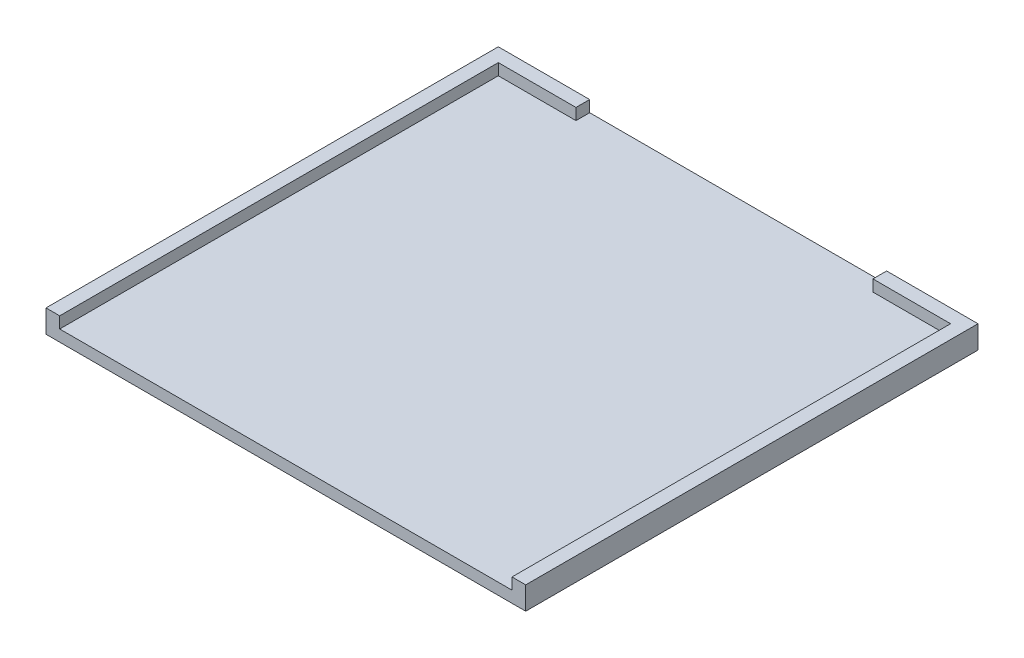
ISO-10303-21;
HEADER;
FILE_DESCRIPTION(('STEP AP214'),'2;1');
FILE_NAME('part.step','',(''),(''),'','','');
FILE_SCHEMA(('AUTOMOTIVE_DESIGN { 1 0 10303 214 1 1 1 1 }'));
ENDSEC;
DATA;
#1=APPLICATION_CONTEXT('core data for automotive mechanical design processes');
#2=APPLICATION_PROTOCOL_DEFINITION('international standard','automotive_design',2000,#1);
#3=PRODUCT_CONTEXT('',#1,'mechanical');
#4=PRODUCT('Part','Part','',(#3));
#5=PRODUCT_RELATED_PRODUCT_CATEGORY('part','',(#4));
#6=PRODUCT_DEFINITION_FORMATION('','',#4);
#7=PRODUCT_DEFINITION_CONTEXT('part definition',#1,'design');
#8=PRODUCT_DEFINITION('design','',#6,#7);
#9=PRODUCT_DEFINITION_SHAPE('','',#8);
#10=(LENGTH_UNIT() NAMED_UNIT(*) SI_UNIT(.MILLI.,.METRE.));
#11=(NAMED_UNIT(*) PLANE_ANGLE_UNIT() SI_UNIT($,.RADIAN.));
#12=(NAMED_UNIT(*) SI_UNIT($,.STERADIAN.) SOLID_ANGLE_UNIT());
#13=UNCERTAINTY_MEASURE_WITH_UNIT(LENGTH_MEASURE(1.E-05),#10,'distance_accuracy_value','');
#14=(GEOMETRIC_REPRESENTATION_CONTEXT(3) GLOBAL_UNCERTAINTY_ASSIGNED_CONTEXT((#13)) GLOBAL_UNIT_ASSIGNED_CONTEXT((#10,
#11,#12)) REPRESENTATION_CONTEXT('',''));
#15=CARTESIAN_POINT('',(0.,0.,0.));
#16=DIRECTION('',(0.,0.,1.));
#17=DIRECTION('',(1.,0.,0.));
#18=AXIS2_PLACEMENT_3D('',#15,#16,#17);
#19=CARTESIAN_POINT('',(-14.5184100452035,0.5,-6.74283836113689));
#20=DIRECTION('',(0.,0.,-1.));
#21=DIRECTION('',(-1.,0.,0.));
#22=AXIS2_PLACEMENT_3D('',#19,#20,#21);
#23=PLANE('',#22);
#24=DIRECTION('',(1.,0.,0.));
#25=VECTOR('',#24,1.);
#26=CARTESIAN_POINT('',(-14.5184100452035,0.,-6.74283836113689));
#27=LINE('',#26,#25);
#28=CARTESIAN_POINT('',(-14.5184100452035,0.,-6.74283836113689));
#29=VERTEX_POINT('',#28);
#30=CARTESIAN_POINT('',(-11.1184100452035,0.,-6.74283836113689));
#31=VERTEX_POINT('',#30);
#32=EDGE_CURVE('E81',#29,#31,#27,.T.);
#33=ORIENTED_EDGE('',*,*,#32,.T.);
#34=DIRECTION('',(0.,-1.,0.));
#35=VECTOR('',#34,1.);
#36=CARTESIAN_POINT('',(-11.1184100452035,0.5,-6.74283836113689));
#37=LINE('',#36,#35);
#38=CARTESIAN_POINT('',(-11.1184100452035,0.5,-6.74283836113689));
#39=VERTEX_POINT('',#38);
#40=EDGE_CURVE('E48',#39,#31,#37,.T.);
#41=ORIENTED_EDGE('',*,*,#40,.F.);
#42=DIRECTION('',(1.,0.,0.));
#43=VECTOR('',#42,1.);
#44=CARTESIAN_POINT('',(-14.5184100452035,0.5,-6.74283836113689));
#45=LINE('',#44,#43);
#46=CARTESIAN_POINT('',(-14.5184100452035,0.5,-6.74283836113689));
#47=VERTEX_POINT('',#46);
#48=EDGE_CURVE('E170',#47,#39,#45,.T.);
#49=ORIENTED_EDGE('',*,*,#48,.F.);
#50=DIRECTION('',(0.,-1.,0.));
#51=VECTOR('',#50,1.);
#52=CARTESIAN_POINT('',(-14.5184100452035,0.5,-6.74283836113689));
#53=LINE('',#52,#51);
#54=EDGE_CURVE('E11',#47,#29,#53,.T.);
#55=ORIENTED_EDGE('',*,*,#54,.T.);
#56=EDGE_LOOP('',(#33,#41,#49,#55));
#57=FACE_BOUND('',#56,.T.);
#58=ADVANCED_FACE('F33',(#57),#23,.F.);
#59=CARTESIAN_POINT('',(0.,0.5,0.));
#60=DIRECTION('',(0.,-1.,0.));
#61=DIRECTION('',(0.,0.,-1.));
#62=AXIS2_PLACEMENT_3D('',#59,#60,#61);
#63=PLANE('',#62);
#64=ORIENTED_EDGE('',*,*,#48,.T.);
#65=DIRECTION('',(0.,0.,1.));
#66=VECTOR('',#65,1.);
#67=CARTESIAN_POINT('',(-11.1184100452035,0.5,-7.34283836113689));
#68=LINE('',#67,#66);
#69=CARTESIAN_POINT('',(-11.1184100452035,0.5,-7.34283836113689));
#70=VERTEX_POINT('',#69);
#71=EDGE_CURVE('E107',#70,#39,#68,.T.);
#72=ORIENTED_EDGE('',*,*,#71,.F.);
#73=DIRECTION('',(-1.,0.,0.));
#74=VECTOR('',#73,1.);
#75=CARTESIAN_POINT('',(-15.1184100452035,0.5,-7.34283836113689));
#76=LINE('',#75,#74);
#77=CARTESIAN_POINT('',(-15.1184100452035,0.5,-7.34283836113689));
#78=VERTEX_POINT('',#77);
#79=EDGE_CURVE('E99',#70,#78,#76,.T.);
#80=ORIENTED_EDGE('',*,*,#79,.T.);
#81=DIRECTION('',(0.,0.,1.));
#82=VECTOR('',#81,1.);
#83=CARTESIAN_POINT('',(-15.1184100452035,0.5,-7.34283836113689));
#84=LINE('',#83,#82);
#85=CARTESIAN_POINT('',(-15.1184100452035,0.5,12.4571616388631));
#86=VERTEX_POINT('',#85);
#87=EDGE_CURVE('E104',#78,#86,#84,.T.);
#88=ORIENTED_EDGE('',*,*,#87,.T.);
#89=DIRECTION('',(1.,0.,0.));
#90=VECTOR('',#89,1.);
#91=CARTESIAN_POINT('',(-14.5184100452035,0.5,12.4571616388631));
#92=LINE('',#91,#90);
#93=CARTESIAN_POINT('',(-14.5184100452035,0.5,12.4571616388631));
#94=VERTEX_POINT('',#93);
#95=EDGE_CURVE('E57',#86,#94,#92,.T.);
#96=ORIENTED_EDGE('',*,*,#95,.T.);
#97=DIRECTION('',(0.,0.,-1.));
#98=VECTOR('',#97,1.);
#99=CARTESIAN_POINT('',(-14.5184100452035,0.5,-6.74283836113689));
#100=LINE('',#99,#98);
#101=EDGE_CURVE('E143',#94,#47,#100,.T.);
#102=ORIENTED_EDGE('',*,*,#101,.T.);
#103=EDGE_LOOP('',(#64,#72,#80,#88,#96,#102));
#104=FACE_BOUND('',#103,.T.);
#105=ADVANCED_FACE('F102',(#104),#63,.F.);
#106=CARTESIAN_POINT('',(-14.5184100452035,0.5,-6.74283836113689));
#107=DIRECTION('',(-1.,0.,0.));
#108=DIRECTION('',(0.,0.,1.));
#109=AXIS2_PLACEMENT_3D('',#106,#107,#108);
#110=PLANE('',#109);
#111=DIRECTION('',(0.,0.,-1.));
#112=VECTOR('',#111,1.);
#113=CARTESIAN_POINT('',(-14.5184100452035,0.,-6.74283836113689));
#114=LINE('',#113,#112);
#115=CARTESIAN_POINT('',(-14.5184100452035,0.,12.4571616388631));
#116=VERTEX_POINT('',#115);
#117=EDGE_CURVE('E135',#116,#29,#114,.T.);
#118=ORIENTED_EDGE('',*,*,#117,.T.);
#119=ORIENTED_EDGE('',*,*,#54,.F.);
#120=ORIENTED_EDGE('',*,*,#101,.F.);
#121=DIRECTION('',(0.,-1.,0.));
#122=VECTOR('',#121,1.);
#123=CARTESIAN_POINT('',(-14.5184100452035,0.5,12.4571616388631));
#124=LINE('',#123,#122);
#125=EDGE_CURVE('E130',#94,#116,#124,.T.);
#126=ORIENTED_EDGE('',*,*,#125,.T.);
#127=EDGE_LOOP('',(#118,#119,#120,#126));
#128=FACE_BOUND('',#127,.T.);
#129=ADVANCED_FACE('F35',(#128),#110,.F.);
#130=CARTESIAN_POINT('',(1.88158995479654,0.500000000000002,-6.74283836113689));
#131=VERTEX_POINT('',#130);
#132=CARTESIAN_POINT('',(5.28158995479654,0.5,-6.74283836113689));
#133=VERTEX_POINT('',#132);
#134=EDGE_CURVE('E162',#131,#133,#45,.T.);
#135=ORIENTED_EDGE('',*,*,#134,.F.);
#136=DIRECTION('',(0.,1.,0.));
#137=VECTOR('',#136,1.);
#138=CARTESIAN_POINT('',(1.88158995479654,0.500000000000002,-6.74283836113689));
#139=LINE('',#138,#137);
#140=CARTESIAN_POINT('',(1.88158995479654,0.,-6.74283836113689));
#141=VERTEX_POINT('',#140);
#142=EDGE_CURVE('E165',#141,#131,#139,.T.);
#143=ORIENTED_EDGE('',*,*,#142,.F.);
#144=CARTESIAN_POINT('',(5.28158995479654,0.,-6.74283836113689));
#145=VERTEX_POINT('',#144);
#146=EDGE_CURVE('E70',#141,#145,#27,.T.);
#147=ORIENTED_EDGE('',*,*,#146,.T.);
#148=DIRECTION('',(0.,-1.,0.));
#149=VECTOR('',#148,1.);
#150=CARTESIAN_POINT('',(5.28158995479654,0.5,-6.74283836113689));
#151=LINE('',#150,#149);
#152=EDGE_CURVE('E41',#133,#145,#151,.T.);
#153=ORIENTED_EDGE('',*,*,#152,.F.);
#154=EDGE_LOOP('',(#135,#143,#147,#153));
#155=FACE_BOUND('',#154,.T.);
#156=ADVANCED_FACE('F160',(#155),#23,.F.);
#157=CARTESIAN_POINT('',(5.28158995479654,0.5,-6.74283836113689));
#158=DIRECTION('',(1.,0.,0.));
#159=DIRECTION('',(0.,0.,-1.));
#160=AXIS2_PLACEMENT_3D('',#157,#158,#159);
#161=PLANE('',#160);
#162=DIRECTION('',(0.,0.,1.));
#163=VECTOR('',#162,1.);
#164=CARTESIAN_POINT('',(5.28158995479654,0.,-6.74283836113689));
#165=LINE('',#164,#163);
#166=CARTESIAN_POINT('',(5.28158995479653,0.,12.4571616388631));
#167=VERTEX_POINT('',#166);
#168=EDGE_CURVE('E140',#145,#167,#165,.T.);
#169=ORIENTED_EDGE('',*,*,#168,.T.);
#170=DIRECTION('',(0.,-1.,0.));
#171=VECTOR('',#170,1.);
#172=CARTESIAN_POINT('',(5.28158995479654,0.5,12.4571616388631));
#173=LINE('',#172,#171);
#174=CARTESIAN_POINT('',(5.28158995479654,0.5,12.4571616388631));
#175=VERTEX_POINT('',#174);
#176=EDGE_CURVE('E151',#175,#167,#173,.T.);
#177=ORIENTED_EDGE('',*,*,#176,.F.);
#178=DIRECTION('',(0.,0.,1.));
#179=VECTOR('',#178,1.);
#180=CARTESIAN_POINT('',(5.28158995479654,0.5,-6.74283836113689));
#181=LINE('',#180,#179);
#182=EDGE_CURVE('E158',#133,#175,#181,.T.);
#183=ORIENTED_EDGE('',*,*,#182,.F.);
#184=ORIENTED_EDGE('',*,*,#152,.T.);
#185=EDGE_LOOP('',(#169,#177,#183,#184));
#186=FACE_BOUND('',#185,.T.);
#187=ADVANCED_FACE('F156',(#186),#161,.F.);
#188=CARTESIAN_POINT('',(5.88158995479654,0.5,-7.34283836113689));
#189=DIRECTION('',(-1.,0.,0.));
#190=DIRECTION('',(0.,0.,1.));
#191=AXIS2_PLACEMENT_3D('',#188,#189,#190);
#192=PLANE('',#191);
#193=DIRECTION('',(0.,-1.,0.));
#194=VECTOR('',#193,1.);
#195=CARTESIAN_POINT('',(5.88158995479654,0.5,12.4571616388631));
#196=LINE('',#195,#194);
#197=CARTESIAN_POINT('',(5.88158995479654,0.5,12.4571616388631));
#198=VERTEX_POINT('',#197);
#199=CARTESIAN_POINT('',(5.88158995479654,-0.5,12.4571616388631));
#200=VERTEX_POINT('',#199);
#201=EDGE_CURVE('E148',#198,#200,#196,.T.);
#202=ORIENTED_EDGE('',*,*,#201,.T.);
#203=DIRECTION('',(0.,0.,1.));
#204=VECTOR('',#203,1.);
#205=CARTESIAN_POINT('',(5.88158995479654,-0.5,12.4571616388631));
#206=LINE('',#205,#204);
#207=CARTESIAN_POINT('',(5.88158995479654,-0.5,-7.34283836113689));
#208=VERTEX_POINT('',#207);
#209=EDGE_CURVE('E138',#208,#200,#206,.T.);
#210=ORIENTED_EDGE('',*,*,#209,.F.);
#211=DIRECTION('',(0.,-1.,0.));
#212=VECTOR('',#211,1.);
#213=CARTESIAN_POINT('',(5.88158995479654,0.5,-7.34283836113689));
#214=LINE('',#213,#212);
#215=CARTESIAN_POINT('',(5.88158995479654,0.5,-7.34283836113689));
#216=VERTEX_POINT('',#215);
#217=EDGE_CURVE('E124',#216,#208,#214,.T.);
#218=ORIENTED_EDGE('',*,*,#217,.F.);
#219=DIRECTION('',(0.,0.,-1.));
#220=VECTOR('',#219,1.);
#221=CARTESIAN_POINT('',(5.88158995479654,0.5,-7.34283836113689));
#222=LINE('',#221,#220);
#223=EDGE_CURVE('E111',#198,#216,#222,.T.);
#224=ORIENTED_EDGE('',*,*,#223,.F.);
#225=EDGE_LOOP('',(#202,#210,#218,#224));
#226=FACE_BOUND('',#225,.T.);
#227=ADVANCED_FACE('F186',(#226),#192,.F.);
#228=CARTESIAN_POINT('',(-15.1184100452035,0.5,-7.34283836113689));
#229=DIRECTION('',(0.,0.,1.));
#230=DIRECTION('',(1.,0.,0.));
#231=AXIS2_PLACEMENT_3D('',#228,#229,#230);
#232=PLANE('',#231);
#233=ORIENTED_EDGE('',*,*,#79,.F.);
#234=DIRECTION('',(0.,-1.,0.));
#235=VECTOR('',#234,1.);
#236=CARTESIAN_POINT('',(-11.1184100452035,0.5,-7.34283836113689));
#237=LINE('',#236,#235);
#238=CARTESIAN_POINT('',(-11.1184100452035,0.,-7.34283836113689));
#239=VERTEX_POINT('',#238);
#240=EDGE_CURVE('E204',#70,#239,#237,.T.);
#241=ORIENTED_EDGE('',*,*,#240,.T.);
#242=DIRECTION('',(1.,0.,0.));
#243=VECTOR('',#242,1.);
#244=CARTESIAN_POINT('',(-11.1184100452035,0.,-7.34283836113689));
#245=LINE('',#244,#243);
#246=CARTESIAN_POINT('',(1.88158995479654,0.,-7.34283836113689));
#247=VERTEX_POINT('',#246);
#248=EDGE_CURVE('E195',#239,#247,#245,.T.);
#249=ORIENTED_EDGE('',*,*,#248,.T.);
#250=DIRECTION('',(0.,1.,0.));
#251=VECTOR('',#250,1.);
#252=CARTESIAN_POINT('',(1.88158995479654,0.500000000000002,-7.34283836113689));
#253=LINE('',#252,#251);
#254=CARTESIAN_POINT('',(1.88158995479654,0.500000000000002,-7.34283836113689));
#255=VERTEX_POINT('',#254);
#256=EDGE_CURVE('E192',#247,#255,#253,.T.);
#257=ORIENTED_EDGE('',*,*,#256,.T.);
#258=EDGE_CURVE('E110',#216,#255,#76,.T.);
#259=ORIENTED_EDGE('',*,*,#258,.F.);
#260=ORIENTED_EDGE('',*,*,#217,.T.);
#261=DIRECTION('',(1.,0.,0.));
#262=VECTOR('',#261,1.);
#263=CARTESIAN_POINT('',(5.88158995479654,-0.5,-7.34283836113689));
#264=LINE('',#263,#262);
#265=CARTESIAN_POINT('',(-15.1184100452035,-0.5,-7.34283836113689));
#266=VERTEX_POINT('',#265);
#267=EDGE_CURVE('E120',#266,#208,#264,.T.);
#268=ORIENTED_EDGE('',*,*,#267,.F.);
#269=DIRECTION('',(0.,-1.,0.));
#270=VECTOR('',#269,1.);
#271=CARTESIAN_POINT('',(-15.1184100452035,0.5,-7.34283836113689));
#272=LINE('',#271,#270);
#273=EDGE_CURVE('E115',#78,#266,#272,.T.);
#274=ORIENTED_EDGE('',*,*,#273,.F.);
#275=EDGE_LOOP('',(#233,#241,#249,#257,#259,#260,#268,#274));
#276=FACE_BOUND('',#275,.T.);
#277=ADVANCED_FACE('F116',(#276),#232,.F.);
#278=CARTESIAN_POINT('',(-15.1184100452035,0.5,-7.34283836113689));
#279=DIRECTION('',(1.,0.,0.));
#280=DIRECTION('',(0.,0.,-1.));
#281=AXIS2_PLACEMENT_3D('',#278,#279,#280);
#282=PLANE('',#281);
#283=ORIENTED_EDGE('',*,*,#273,.T.);
#284=DIRECTION('',(0.,0.,-1.));
#285=VECTOR('',#284,1.);
#286=CARTESIAN_POINT('',(-15.1184100452035,-0.5,-7.34283836113689));
#287=LINE('',#286,#285);
#288=CARTESIAN_POINT('',(-15.1184100452035,-0.5,12.4571616388631));
#289=VERTEX_POINT('',#288);
#290=EDGE_CURVE('E218',#289,#266,#287,.T.);
#291=ORIENTED_EDGE('',*,*,#290,.F.);
#292=DIRECTION('',(0.,-1.,0.));
#293=VECTOR('',#292,1.);
#294=CARTESIAN_POINT('',(-15.1184100452035,0.5,12.4571616388631));
#295=LINE('',#294,#293);
#296=EDGE_CURVE('E125',#86,#289,#295,.T.);
#297=ORIENTED_EDGE('',*,*,#296,.F.);
#298=ORIENTED_EDGE('',*,*,#87,.F.);
#299=EDGE_LOOP('',(#283,#291,#297,#298));
#300=FACE_BOUND('',#299,.T.);
#301=ADVANCED_FACE('F127',(#300),#282,.F.);
#302=CARTESIAN_POINT('',(-14.5184100452035,0.5,12.4571616388631));
#303=DIRECTION('',(0.,0.,-1.));
#304=DIRECTION('',(-1.,0.,0.));
#305=AXIS2_PLACEMENT_3D('',#302,#303,#304);
#306=PLANE('',#305);
#307=ORIENTED_EDGE('',*,*,#296,.T.);
#308=DIRECTION('',(-1.,0.,0.));
#309=VECTOR('',#308,1.);
#310=CARTESIAN_POINT('',(-15.1184100452035,-0.5,12.4571616388631));
#311=LINE('',#310,#309);
#312=EDGE_CURVE('E215',#200,#289,#311,.T.);
#313=ORIENTED_EDGE('',*,*,#312,.F.);
#314=ORIENTED_EDGE('',*,*,#201,.F.);
#315=DIRECTION('',(1.,0.,0.));
#316=VECTOR('',#315,1.);
#317=CARTESIAN_POINT('',(5.28158995479654,0.5,12.4571616388631));
#318=LINE('',#317,#316);
#319=EDGE_CURVE('E176',#175,#198,#318,.T.);
#320=ORIENTED_EDGE('',*,*,#319,.F.);
#321=ORIENTED_EDGE('',*,*,#176,.T.);
#322=DIRECTION('',(-1.,0.,0.));
#323=VECTOR('',#322,1.);
#324=CARTESIAN_POINT('',(-15.1184100452035,0.,12.4571616388631));
#325=LINE('',#324,#323);
#326=EDGE_CURVE('E211',#167,#116,#325,.T.);
#327=ORIENTED_EDGE('',*,*,#326,.T.);
#328=ORIENTED_EDGE('',*,*,#125,.F.);
#329=ORIENTED_EDGE('',*,*,#95,.F.);
#330=EDGE_LOOP('',(#307,#313,#314,#320,#321,#327,#328,#329));
#331=FACE_BOUND('',#330,.T.);
#332=ADVANCED_FACE('F224',(#331),#306,.F.);
#333=ORIENTED_EDGE('',*,*,#258,.T.);
#334=DIRECTION('',(0.,0.,1.));
#335=VECTOR('',#334,1.);
#336=CARTESIAN_POINT('',(1.88158995479654,0.500000000000002,-7.34283836113689));
#337=LINE('',#336,#335);
#338=EDGE_CURVE('E212',#255,#131,#337,.T.);
#339=ORIENTED_EDGE('',*,*,#338,.T.);
#340=ORIENTED_EDGE('',*,*,#134,.T.);
#341=ORIENTED_EDGE('',*,*,#182,.T.);
#342=ORIENTED_EDGE('',*,*,#319,.T.);
#343=ORIENTED_EDGE('',*,*,#223,.T.);
#344=EDGE_LOOP('',(#333,#339,#340,#341,#342,#343));
#345=FACE_BOUND('',#344,.T.);
#346=ADVANCED_FACE('F179',(#345),#63,.F.);
#347=CARTESIAN_POINT('',(0.,0.,0.));
#348=DIRECTION('',(0.,1.,0.));
#349=DIRECTION('',(0.,0.,1.));
#350=AXIS2_PLACEMENT_3D('',#347,#348,#349);
#351=PLANE('',#350);
#352=ORIENTED_EDGE('',*,*,#117,.F.);
#353=ORIENTED_EDGE('',*,*,#326,.F.);
#354=ORIENTED_EDGE('',*,*,#168,.F.);
#355=ORIENTED_EDGE('',*,*,#146,.F.);
#356=DIRECTION('',(0.,0.,1.));
#357=VECTOR('',#356,1.);
#358=CARTESIAN_POINT('',(1.88158995479654,0.,-7.34283836113689));
#359=LINE('',#358,#357);
#360=EDGE_CURVE('E202',#247,#141,#359,.T.);
#361=ORIENTED_EDGE('',*,*,#360,.F.);
#362=ORIENTED_EDGE('',*,*,#248,.F.);
#363=DIRECTION('',(0.,0.,1.));
#364=VECTOR('',#363,1.);
#365=CARTESIAN_POINT('',(-11.1184100452035,0.,-7.34283836113689));
#366=LINE('',#365,#364);
#367=EDGE_CURVE('E200',#239,#31,#366,.T.);
#368=ORIENTED_EDGE('',*,*,#367,.T.);
#369=ORIENTED_EDGE('',*,*,#32,.F.);
#370=EDGE_LOOP('',(#352,#353,#354,#355,#361,#362,#368,#369));
#371=FACE_BOUND('',#370,.T.);
#372=ADVANCED_FACE('F280',(#371),#351,.T.);
#373=CARTESIAN_POINT('',(0.,-0.5,0.));
#374=DIRECTION('',(0.,1.,0.));
#375=DIRECTION('',(0.,0.,1.));
#376=AXIS2_PLACEMENT_3D('',#373,#374,#375);
#377=PLANE('',#376);
#378=ORIENTED_EDGE('',*,*,#312,.T.);
#379=ORIENTED_EDGE('',*,*,#290,.T.);
#380=ORIENTED_EDGE('',*,*,#267,.T.);
#381=ORIENTED_EDGE('',*,*,#209,.T.);
#382=EDGE_LOOP('',(#378,#379,#380,#381));
#383=FACE_BOUND('',#382,.T.);
#384=ADVANCED_FACE('F291',(#383),#377,.F.);
#385=CARTESIAN_POINT('',(-11.1184100452035,0.5,-7.34283836113689));
#386=DIRECTION('',(-1.,0.,0.));
#387=DIRECTION('',(0.,0.,1.));
#388=AXIS2_PLACEMENT_3D('',#385,#386,#387);
#389=PLANE('',#388);
#390=ORIENTED_EDGE('',*,*,#40,.T.);
#391=ORIENTED_EDGE('',*,*,#367,.F.);
#392=ORIENTED_EDGE('',*,*,#240,.F.);
#393=ORIENTED_EDGE('',*,*,#71,.T.);
#394=EDGE_LOOP('',(#390,#391,#392,#393));
#395=FACE_BOUND('',#394,.T.);
#396=ADVANCED_FACE('F299',(#395),#389,.F.);
#397=CARTESIAN_POINT('',(1.88158995479654,0.500000000000002,-7.34283836113689));
#398=DIRECTION('',(1.,0.,0.));
#399=DIRECTION('',(0.,0.,-1.));
#400=AXIS2_PLACEMENT_3D('',#397,#398,#399);
#401=PLANE('',#400);
#402=ORIENTED_EDGE('',*,*,#142,.T.);
#403=ORIENTED_EDGE('',*,*,#338,.F.);
#404=ORIENTED_EDGE('',*,*,#256,.F.);
#405=ORIENTED_EDGE('',*,*,#360,.T.);
#406=EDGE_LOOP('',(#402,#403,#404,#405));
#407=FACE_BOUND('',#406,.T.);
#408=ADVANCED_FACE('F303',(#407),#401,.F.);
#409=CLOSED_SHELL('',(#58,#105,#129,#156,#187,#227,#277,#301,#332,#346,#372,#384,#396,#408));
#410=MANIFOLD_SOLID_BREP('B2',#409);
#411=ADVANCED_BREP_SHAPE_REPRESENTATION('',(#18,#410),#14);
#412=SHAPE_DEFINITION_REPRESENTATION(#9,#411);
ENDSEC;
END-ISO-10303-21;
